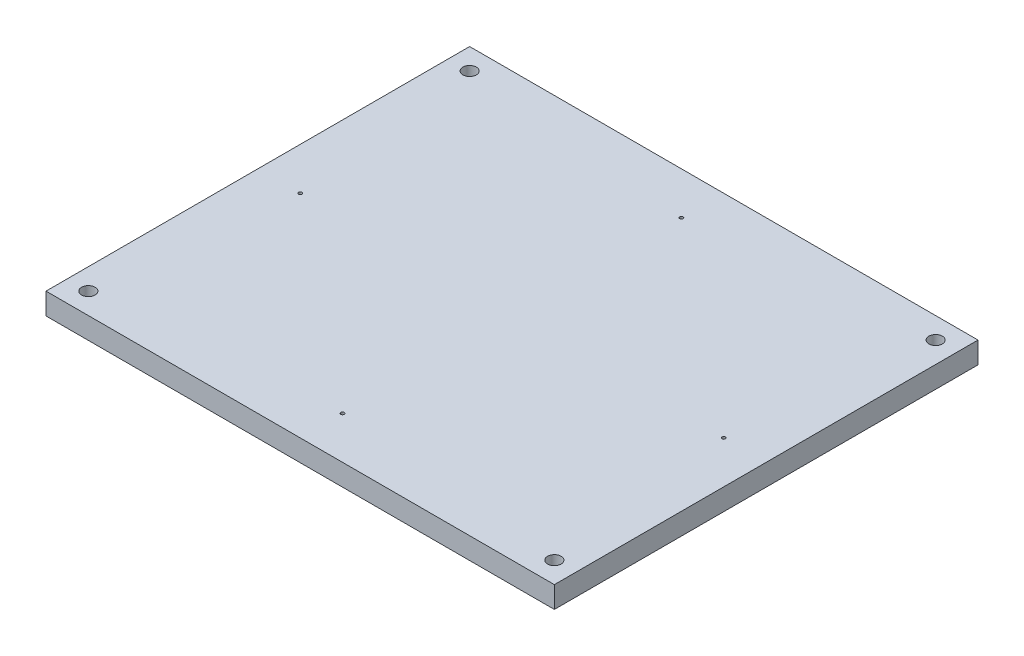
ISO-10303-21;
HEADER;
FILE_DESCRIPTION(('STEP AP214'),'2;1');
FILE_NAME('part.step','',(''),(''),'','','');
FILE_SCHEMA(('AUTOMOTIVE_DESIGN { 1 0 10303 214 1 1 1 1 }'));
ENDSEC;
DATA;
#1=APPLICATION_CONTEXT('core data for automotive mechanical design processes');
#2=APPLICATION_PROTOCOL_DEFINITION('international standard','automotive_design',2000,#1);
#3=PRODUCT_CONTEXT('',#1,'mechanical');
#4=PRODUCT('Part','Part','',(#3));
#5=PRODUCT_RELATED_PRODUCT_CATEGORY('part','',(#4));
#6=PRODUCT_DEFINITION_FORMATION('','',#4);
#7=PRODUCT_DEFINITION_CONTEXT('part definition',#1,'design');
#8=PRODUCT_DEFINITION('design','',#6,#7);
#9=PRODUCT_DEFINITION_SHAPE('','',#8);
#10=(LENGTH_UNIT() NAMED_UNIT(*) SI_UNIT(.MILLI.,.METRE.));
#11=(NAMED_UNIT(*) PLANE_ANGLE_UNIT() SI_UNIT($,.RADIAN.));
#12=(NAMED_UNIT(*) SI_UNIT($,.STERADIAN.) SOLID_ANGLE_UNIT());
#13=UNCERTAINTY_MEASURE_WITH_UNIT(LENGTH_MEASURE(1.E-05),#10,'distance_accuracy_value','');
#14=(GEOMETRIC_REPRESENTATION_CONTEXT(3) GLOBAL_UNCERTAINTY_ASSIGNED_CONTEXT((#13)) GLOBAL_UNIT_ASSIGNED_CONTEXT((#10,
#11,#12)) REPRESENTATION_CONTEXT('',''));
#15=CARTESIAN_POINT('',(0.,0.,0.));
#16=DIRECTION('',(0.,0.,1.));
#17=DIRECTION('',(1.,0.,0.));
#18=AXIS2_PLACEMENT_3D('',#15,#16,#17);
#19=CARTESIAN_POINT('',(600.,50.8,500.));
#20=DIRECTION('',(-1.,0.,0.));
#21=DIRECTION('',(0.,0.,1.));
#22=AXIS2_PLACEMENT_3D('',#19,#20,#21);
#23=PLANE('',#22);
#24=DIRECTION('',(0.,0.,-1.));
#25=VECTOR('',#24,1.);
#26=CARTESIAN_POINT('',(600.,0.,500.));
#27=LINE('',#26,#25);
#28=CARTESIAN_POINT('',(600.,0.,500.));
#29=VERTEX_POINT('',#28);
#30=CARTESIAN_POINT('',(600.,0.,-500.));
#31=VERTEX_POINT('',#30);
#32=EDGE_CURVE('E148',#29,#31,#27,.T.);
#33=ORIENTED_EDGE('',*,*,#32,.T.);
#34=DIRECTION('',(0.,-1.,0.));
#35=VECTOR('',#34,1.);
#36=CARTESIAN_POINT('',(600.,50.8,-500.));
#37=LINE('',#36,#35);
#38=CARTESIAN_POINT('',(600.,50.8,-500.));
#39=VERTEX_POINT('',#38);
#40=EDGE_CURVE('E11',#39,#31,#37,.T.);
#41=ORIENTED_EDGE('',*,*,#40,.F.);
#42=DIRECTION('',(0.,0.,-1.));
#43=VECTOR('',#42,1.);
#44=CARTESIAN_POINT('',(600.,50.8,500.));
#45=LINE('',#44,#43);
#46=CARTESIAN_POINT('',(600.,50.8,500.));
#47=VERTEX_POINT('',#46);
#48=EDGE_CURVE('E151',#47,#39,#45,.T.);
#49=ORIENTED_EDGE('',*,*,#48,.F.);
#50=DIRECTION('',(0.,-1.,0.));
#51=VECTOR('',#50,1.);
#52=CARTESIAN_POINT('',(600.,50.8,500.));
#53=LINE('',#52,#51);
#54=EDGE_CURVE('E157',#47,#29,#53,.T.);
#55=ORIENTED_EDGE('',*,*,#54,.T.);
#56=EDGE_LOOP('',(#33,#41,#49,#55));
#57=FACE_BOUND('',#56,.T.);
#58=ADVANCED_FACE('F33',(#57),#23,.F.);
#59=CARTESIAN_POINT('',(-600.,50.8,-500.));
#60=DIRECTION('',(0.,0.,1.));
#61=DIRECTION('',(1.,0.,0.));
#62=AXIS2_PLACEMENT_3D('',#59,#60,#61);
#63=PLANE('',#62);
#64=DIRECTION('',(-1.,0.,0.));
#65=VECTOR('',#64,1.);
#66=CARTESIAN_POINT('',(-600.,0.,-500.));
#67=LINE('',#66,#65);
#68=CARTESIAN_POINT('',(-600.,0.,-500.));
#69=VERTEX_POINT('',#68);
#70=EDGE_CURVE('E160',#31,#69,#67,.T.);
#71=ORIENTED_EDGE('',*,*,#70,.T.);
#72=DIRECTION('',(0.,-1.,0.));
#73=VECTOR('',#72,1.);
#74=CARTESIAN_POINT('',(-600.,50.8,-500.));
#75=LINE('',#74,#73);
#76=CARTESIAN_POINT('',(-600.,50.8,-500.));
#77=VERTEX_POINT('',#76);
#78=EDGE_CURVE('E41',#77,#69,#75,.T.);
#79=ORIENTED_EDGE('',*,*,#78,.F.);
#80=DIRECTION('',(-1.,0.,0.));
#81=VECTOR('',#80,1.);
#82=CARTESIAN_POINT('',(-600.,50.8,-500.));
#83=LINE('',#82,#81);
#84=EDGE_CURVE('E80',#39,#77,#83,.T.);
#85=ORIENTED_EDGE('',*,*,#84,.F.);
#86=ORIENTED_EDGE('',*,*,#40,.T.);
#87=EDGE_LOOP('',(#71,#79,#85,#86));
#88=FACE_BOUND('',#87,.T.);
#89=ADVANCED_FACE('F184',(#88),#63,.F.);
#90=CARTESIAN_POINT('',(-600.,50.8,500.));
#91=DIRECTION('',(1.,0.,0.));
#92=DIRECTION('',(0.,0.,-1.));
#93=AXIS2_PLACEMENT_3D('',#90,#91,#92);
#94=PLANE('',#93);
#95=DIRECTION('',(0.,0.,1.));
#96=VECTOR('',#95,1.);
#97=CARTESIAN_POINT('',(-600.,0.,500.));
#98=LINE('',#97,#96);
#99=CARTESIAN_POINT('',(-600.,0.,500.));
#100=VERTEX_POINT('',#99);
#101=EDGE_CURVE('E67',#69,#100,#98,.T.);
#102=ORIENTED_EDGE('',*,*,#101,.T.);
#103=DIRECTION('',(0.,-1.,0.));
#104=VECTOR('',#103,1.);
#105=CARTESIAN_POINT('',(-600.,50.8,500.));
#106=LINE('',#105,#104);
#107=CARTESIAN_POINT('',(-600.,50.8,500.));
#108=VERTEX_POINT('',#107);
#109=EDGE_CURVE('E165',#108,#100,#106,.T.);
#110=ORIENTED_EDGE('',*,*,#109,.F.);
#111=DIRECTION('',(0.,0.,1.));
#112=VECTOR('',#111,1.);
#113=CARTESIAN_POINT('',(-600.,50.8,500.));
#114=LINE('',#113,#112);
#115=EDGE_CURVE('E154',#77,#108,#114,.T.);
#116=ORIENTED_EDGE('',*,*,#115,.F.);
#117=ORIENTED_EDGE('',*,*,#78,.T.);
#118=EDGE_LOOP('',(#102,#110,#116,#117));
#119=FACE_BOUND('',#118,.T.);
#120=ADVANCED_FACE('F167',(#119),#94,.F.);
#121=CARTESIAN_POINT('',(-600.,50.8,500.));
#122=DIRECTION('',(0.,0.,-1.));
#123=DIRECTION('',(-1.,0.,0.));
#124=AXIS2_PLACEMENT_3D('',#121,#122,#123);
#125=PLANE('',#124);
#126=DIRECTION('',(1.,0.,0.));
#127=VECTOR('',#126,1.);
#128=CARTESIAN_POINT('',(-600.,0.,500.));
#129=LINE('',#128,#127);
#130=EDGE_CURVE('E73',#100,#29,#129,.T.);
#131=ORIENTED_EDGE('',*,*,#130,.T.);
#132=ORIENTED_EDGE('',*,*,#54,.F.);
#133=DIRECTION('',(1.,0.,0.));
#134=VECTOR('',#133,1.);
#135=CARTESIAN_POINT('',(-600.,50.8,500.));
#136=LINE('',#135,#134);
#137=EDGE_CURVE('E49',#108,#47,#136,.T.);
#138=ORIENTED_EDGE('',*,*,#137,.F.);
#139=ORIENTED_EDGE('',*,*,#109,.T.);
#140=EDGE_LOOP('',(#131,#132,#138,#139));
#141=FACE_BOUND('',#140,.T.);
#142=ADVANCED_FACE('F174',(#141),#125,.F.);
#143=CARTESIAN_POINT('',(0.,50.8,0.));
#144=DIRECTION('',(0.,-1.,0.));
#145=DIRECTION('',(0.,0.,-1.));
#146=AXIS2_PLACEMENT_3D('',#143,#144,#145);
#147=PLANE('',#146);
#148=CARTESIAN_POINT('',(-500.,50.8,0.));
#149=DIRECTION('',(0.,1.,0.));
#150=DIRECTION('',(0.,0.,1.));
#151=AXIS2_PLACEMENT_3D('',#148,#149,#150);
#152=CIRCLE('',#151,4.);
#153=CARTESIAN_POINT('',(-500.,50.8,4.));
#154=VERTEX_POINT('',#153);
#155=EDGE_CURVE('E104',#154,#154,#152,.T.);
#156=ORIENTED_EDGE('',*,*,#155,.F.);
#157=EDGE_LOOP('',(#156));
#158=FACE_BOUND('',#157,.T.);
#159=CARTESIAN_POINT('',(0.,50.8,-400.));
#160=DIRECTION('',(0.,1.,0.));
#161=DIRECTION('',(0.,0.,1.));
#162=AXIS2_PLACEMENT_3D('',#159,#160,#161);
#163=CIRCLE('',#162,4.);
#164=CARTESIAN_POINT('',(0.,50.8,-396.));
#165=VERTEX_POINT('',#164);
#166=EDGE_CURVE('E103',#165,#165,#163,.T.);
#167=ORIENTED_EDGE('',*,*,#166,.F.);
#168=EDGE_LOOP('',(#167));
#169=FACE_BOUND('',#168,.T.);
#170=CARTESIAN_POINT('',(500.,50.8,0.));
#171=DIRECTION('',(0.,1.,0.));
#172=DIRECTION('',(0.,0.,1.));
#173=AXIS2_PLACEMENT_3D('',#170,#171,#172);
#174=CIRCLE('',#173,4.);
#175=CARTESIAN_POINT('',(500.,50.8,4.));
#176=VERTEX_POINT('',#175);
#177=EDGE_CURVE('E114',#176,#176,#174,.T.);
#178=ORIENTED_EDGE('',*,*,#177,.F.);
#179=EDGE_LOOP('',(#178));
#180=FACE_BOUND('',#179,.T.);
#181=CARTESIAN_POINT('',(0.,50.8,400.));
#182=DIRECTION('',(0.,1.,0.));
#183=DIRECTION('',(0.,0.,1.));
#184=AXIS2_PLACEMENT_3D('',#181,#182,#183);
#185=CIRCLE('',#184,4.);
#186=CARTESIAN_POINT('',(0.,50.8,404.));
#187=VERTEX_POINT('',#186);
#188=EDGE_CURVE('E120',#187,#187,#185,.T.);
#189=ORIENTED_EDGE('',*,*,#188,.F.);
#190=EDGE_LOOP('',(#189));
#191=FACE_BOUND('',#190,.T.);
#192=CARTESIAN_POINT('',(-550.,50.8,450.));
#193=DIRECTION('',(0.,1.,0.));
#194=DIRECTION('',(0.,0.,1.));
#195=AXIS2_PLACEMENT_3D('',#192,#193,#194);
#196=CIRCLE('',#195,16.);
#197=CARTESIAN_POINT('',(-550.,50.8,466.));
#198=VERTEX_POINT('',#197);
#199=EDGE_CURVE('E126',#198,#198,#196,.T.);
#200=ORIENTED_EDGE('',*,*,#199,.F.);
#201=EDGE_LOOP('',(#200));
#202=FACE_BOUND('',#201,.T.);
#203=CARTESIAN_POINT('',(550.,50.8,450.));
#204=DIRECTION('',(0.,1.,0.));
#205=DIRECTION('',(0.,0.,1.));
#206=AXIS2_PLACEMENT_3D('',#203,#204,#205);
#207=CIRCLE('',#206,16.);
#208=CARTESIAN_POINT('',(550.,50.8,466.));
#209=VERTEX_POINT('',#208);
#210=EDGE_CURVE('E130',#209,#209,#207,.T.);
#211=ORIENTED_EDGE('',*,*,#210,.F.);
#212=EDGE_LOOP('',(#211));
#213=FACE_BOUND('',#212,.T.);
#214=CARTESIAN_POINT('',(550.,50.8,-450.));
#215=DIRECTION('',(0.,1.,0.));
#216=DIRECTION('',(0.,0.,1.));
#217=AXIS2_PLACEMENT_3D('',#214,#215,#216);
#218=CIRCLE('',#217,16.);
#219=CARTESIAN_POINT('',(550.,50.8,-434.));
#220=VERTEX_POINT('',#219);
#221=EDGE_CURVE('E136',#220,#220,#218,.T.);
#222=ORIENTED_EDGE('',*,*,#221,.F.);
#223=EDGE_LOOP('',(#222));
#224=FACE_BOUND('',#223,.T.);
#225=CARTESIAN_POINT('',(-550.,50.8,-450.));
#226=DIRECTION('',(0.,1.,0.));
#227=DIRECTION('',(0.,0.,1.));
#228=AXIS2_PLACEMENT_3D('',#225,#226,#227);
#229=CIRCLE('',#228,16.);
#230=CARTESIAN_POINT('',(-550.,50.8,-434.));
#231=VERTEX_POINT('',#230);
#232=EDGE_CURVE('E142',#231,#231,#229,.T.);
#233=ORIENTED_EDGE('',*,*,#232,.F.);
#234=EDGE_LOOP('',(#233));
#235=FACE_BOUND('',#234,.T.);
#236=ORIENTED_EDGE('',*,*,#48,.T.);
#237=ORIENTED_EDGE('',*,*,#84,.T.);
#238=ORIENTED_EDGE('',*,*,#115,.T.);
#239=ORIENTED_EDGE('',*,*,#137,.T.);
#240=EDGE_LOOP('',(#236,#237,#238,#239));
#241=FACE_BOUND('',#240,.T.);
#242=ADVANCED_FACE('F176',(#158,#169,#180,#191,#202,#213,#224,#235,#241),#147,.F.);
#243=CARTESIAN_POINT('',(0.,0.,0.));
#244=DIRECTION('',(0.,-1.,0.));
#245=DIRECTION('',(0.,0.,-1.));
#246=AXIS2_PLACEMENT_3D('',#243,#244,#245);
#247=PLANE('',#246);
#248=CARTESIAN_POINT('',(-550.,0.,450.));
#249=DIRECTION('',(0.,1.,0.));
#250=DIRECTION('',(0.,0.,1.));
#251=AXIS2_PLACEMENT_3D('',#248,#249,#250);
#252=CIRCLE('',#251,16.);
#253=CARTESIAN_POINT('',(-550.,0.,466.));
#254=VERTEX_POINT('',#253);
#255=EDGE_CURVE('E127',#254,#254,#252,.T.);
#256=ORIENTED_EDGE('',*,*,#255,.T.);
#257=EDGE_LOOP('',(#256));
#258=FACE_BOUND('',#257,.T.);
#259=CARTESIAN_POINT('',(550.,0.,450.));
#260=DIRECTION('',(0.,1.,0.));
#261=DIRECTION('',(0.,0.,1.));
#262=AXIS2_PLACEMENT_3D('',#259,#260,#261);
#263=CIRCLE('',#262,16.);
#264=CARTESIAN_POINT('',(550.,0.,466.));
#265=VERTEX_POINT('',#264);
#266=EDGE_CURVE('E133',#265,#265,#263,.T.);
#267=ORIENTED_EDGE('',*,*,#266,.T.);
#268=EDGE_LOOP('',(#267));
#269=FACE_BOUND('',#268,.T.);
#270=CARTESIAN_POINT('',(550.,0.,-450.));
#271=DIRECTION('',(0.,1.,0.));
#272=DIRECTION('',(0.,0.,1.));
#273=AXIS2_PLACEMENT_3D('',#270,#271,#272);
#274=CIRCLE('',#273,16.);
#275=CARTESIAN_POINT('',(550.,0.,-434.));
#276=VERTEX_POINT('',#275);
#277=EDGE_CURVE('E139',#276,#276,#274,.T.);
#278=ORIENTED_EDGE('',*,*,#277,.T.);
#279=EDGE_LOOP('',(#278));
#280=FACE_BOUND('',#279,.T.);
#281=CARTESIAN_POINT('',(-550.,0.,-450.));
#282=DIRECTION('',(0.,1.,0.));
#283=DIRECTION('',(0.,0.,1.));
#284=AXIS2_PLACEMENT_3D('',#281,#282,#283);
#285=CIRCLE('',#284,16.);
#286=CARTESIAN_POINT('',(-550.,0.,-434.));
#287=VERTEX_POINT('',#286);
#288=EDGE_CURVE('E145',#287,#287,#285,.T.);
#289=ORIENTED_EDGE('',*,*,#288,.T.);
#290=EDGE_LOOP('',(#289));
#291=FACE_BOUND('',#290,.T.);
#292=ORIENTED_EDGE('',*,*,#32,.F.);
#293=ORIENTED_EDGE('',*,*,#130,.F.);
#294=ORIENTED_EDGE('',*,*,#101,.F.);
#295=ORIENTED_EDGE('',*,*,#70,.F.);
#296=EDGE_LOOP('',(#292,#293,#294,#295));
#297=FACE_BOUND('',#296,.T.);
#298=ADVANCED_FACE('F170',(#258,#269,#280,#291,#297),#247,.T.);
#299=CARTESIAN_POINT('',(-550.,0.,-450.));
#300=DIRECTION('',(0.,1.,0.));
#301=DIRECTION('',(0.,0.,1.));
#302=AXIS2_PLACEMENT_3D('',#299,#300,#301);
#303=CYLINDRICAL_SURFACE('',#302,16.);
#304=ORIENTED_EDGE('',*,*,#288,.F.);
#305=EDGE_LOOP('',(#304));
#306=FACE_BOUND('',#305,.T.);
#307=ORIENTED_EDGE('',*,*,#232,.T.);
#308=EDGE_LOOP('',(#307));
#309=FACE_BOUND('',#308,.T.);
#310=ADVANCED_FACE('F211',(#306,#309),#303,.F.);
#311=CARTESIAN_POINT('',(550.,0.,-450.));
#312=DIRECTION('',(0.,1.,0.));
#313=DIRECTION('',(0.,0.,1.));
#314=AXIS2_PLACEMENT_3D('',#311,#312,#313);
#315=CYLINDRICAL_SURFACE('',#314,16.);
#316=ORIENTED_EDGE('',*,*,#277,.F.);
#317=EDGE_LOOP('',(#316));
#318=FACE_BOUND('',#317,.T.);
#319=ORIENTED_EDGE('',*,*,#221,.T.);
#320=EDGE_LOOP('',(#319));
#321=FACE_BOUND('',#320,.T.);
#322=ADVANCED_FACE('F220',(#318,#321),#315,.F.);
#323=CARTESIAN_POINT('',(550.,0.,450.));
#324=DIRECTION('',(0.,1.,0.));
#325=DIRECTION('',(0.,0.,1.));
#326=AXIS2_PLACEMENT_3D('',#323,#324,#325);
#327=CYLINDRICAL_SURFACE('',#326,16.);
#328=ORIENTED_EDGE('',*,*,#266,.F.);
#329=EDGE_LOOP('',(#328));
#330=FACE_BOUND('',#329,.T.);
#331=ORIENTED_EDGE('',*,*,#210,.T.);
#332=EDGE_LOOP('',(#331));
#333=FACE_BOUND('',#332,.T.);
#334=ADVANCED_FACE('F230',(#330,#333),#327,.F.);
#335=CARTESIAN_POINT('',(-550.,0.,450.));
#336=DIRECTION('',(0.,1.,0.));
#337=DIRECTION('',(0.,0.,1.));
#338=AXIS2_PLACEMENT_3D('',#335,#336,#337);
#339=CYLINDRICAL_SURFACE('',#338,16.);
#340=ORIENTED_EDGE('',*,*,#255,.F.);
#341=EDGE_LOOP('',(#340));
#342=FACE_BOUND('',#341,.T.);
#343=ORIENTED_EDGE('',*,*,#199,.T.);
#344=EDGE_LOOP('',(#343));
#345=FACE_BOUND('',#344,.T.);
#346=ADVANCED_FACE('F240',(#342,#345),#339,.F.);
#347=CARTESIAN_POINT('',(0.,35.8,400.));
#348=DIRECTION('',(0.,1.,0.));
#349=DIRECTION('',(0.,0.,1.));
#350=AXIS2_PLACEMENT_3D('',#347,#348,#349);
#351=CONICAL_SURFACE('',#350,4.,1.02974425867665);
#352=CARTESIAN_POINT('',(0.,33.3965575238898,400.));
#353=VERTEX_POINT('',#352);
#354=VERTEX_LOOP('',#353);
#355=FACE_BOUND('',#354,.T.);
#356=CARTESIAN_POINT('',(0.,35.8,400.));
#357=DIRECTION('',(0.,1.,0.));
#358=DIRECTION('',(0.,0.,1.));
#359=AXIS2_PLACEMENT_3D('',#356,#357,#358);
#360=CIRCLE('',#359,4.);
#361=CARTESIAN_POINT('',(0.,35.8,404.));
#362=VERTEX_POINT('',#361);
#363=EDGE_CURVE('E123',#362,#362,#360,.T.);
#364=ORIENTED_EDGE('',*,*,#363,.T.);
#365=EDGE_LOOP('',(#364));
#366=FACE_BOUND('',#365,.T.);
#367=ADVANCED_FACE('F250',(#355,#366),#351,.F.);
#368=CARTESIAN_POINT('',(0.,50.8,400.));
#369=DIRECTION('',(0.,1.,0.));
#370=DIRECTION('',(0.,0.,1.));
#371=AXIS2_PLACEMENT_3D('',#368,#369,#370);
#372=CYLINDRICAL_SURFACE('',#371,4.);
#373=ORIENTED_EDGE('',*,*,#363,.F.);
#374=EDGE_LOOP('',(#373));
#375=FACE_BOUND('',#374,.T.);
#376=ORIENTED_EDGE('',*,*,#188,.T.);
#377=EDGE_LOOP('',(#376));
#378=FACE_BOUND('',#377,.T.);
#379=ADVANCED_FACE('F265',(#375,#378),#372,.F.);
#380=CARTESIAN_POINT('',(500.,35.8,0.));
#381=DIRECTION('',(0.,1.,0.));
#382=DIRECTION('',(0.,0.,1.));
#383=AXIS2_PLACEMENT_3D('',#380,#381,#382);
#384=CONICAL_SURFACE('',#383,4.,1.02974425867666);
#385=CARTESIAN_POINT('',(500.,33.3965575238898,0.));
#386=VERTEX_POINT('',#385);
#387=VERTEX_LOOP('',#386);
#388=FACE_BOUND('',#387,.T.);
#389=CARTESIAN_POINT('',(500.,35.8,0.));
#390=DIRECTION('',(0.,1.,0.));
#391=DIRECTION('',(0.,0.,1.));
#392=AXIS2_PLACEMENT_3D('',#389,#390,#391);
#393=CIRCLE('',#392,4.);
#394=CARTESIAN_POINT('',(500.,35.8,4.));
#395=VERTEX_POINT('',#394);
#396=EDGE_CURVE('E117',#395,#395,#393,.T.);
#397=ORIENTED_EDGE('',*,*,#396,.T.);
#398=EDGE_LOOP('',(#397));
#399=FACE_BOUND('',#398,.T.);
#400=ADVANCED_FACE('F275',(#388,#399),#384,.F.);
#401=CARTESIAN_POINT('',(500.,50.8,0.));
#402=DIRECTION('',(0.,1.,0.));
#403=DIRECTION('',(0.,0.,1.));
#404=AXIS2_PLACEMENT_3D('',#401,#402,#403);
#405=CYLINDRICAL_SURFACE('',#404,4.);
#406=ORIENTED_EDGE('',*,*,#396,.F.);
#407=EDGE_LOOP('',(#406));
#408=FACE_BOUND('',#407,.T.);
#409=ORIENTED_EDGE('',*,*,#177,.T.);
#410=EDGE_LOOP('',(#409));
#411=FACE_BOUND('',#410,.T.);
#412=ADVANCED_FACE('F285',(#408,#411),#405,.F.);
#413=CARTESIAN_POINT('',(0.,35.8,-400.));
#414=DIRECTION('',(0.,1.,0.));
#415=DIRECTION('',(0.,0.,1.));
#416=AXIS2_PLACEMENT_3D('',#413,#414,#415);
#417=CONICAL_SURFACE('',#416,4.,1.02974425867665);
#418=CARTESIAN_POINT('',(0.,33.3965575238898,-400.));
#419=VERTEX_POINT('',#418);
#420=VERTEX_LOOP('',#419);
#421=FACE_BOUND('',#420,.T.);
#422=CARTESIAN_POINT('',(0.,35.8,-400.));
#423=DIRECTION('',(0.,1.,0.));
#424=DIRECTION('',(0.,0.,1.));
#425=AXIS2_PLACEMENT_3D('',#422,#423,#424);
#426=CIRCLE('',#425,4.);
#427=CARTESIAN_POINT('',(0.,35.8,-396.));
#428=VERTEX_POINT('',#427);
#429=EDGE_CURVE('E107',#428,#428,#426,.T.);
#430=ORIENTED_EDGE('',*,*,#429,.T.);
#431=EDGE_LOOP('',(#430));
#432=FACE_BOUND('',#431,.T.);
#433=ADVANCED_FACE('F295',(#421,#432),#417,.F.);
#434=CARTESIAN_POINT('',(0.,50.8,-400.));
#435=DIRECTION('',(0.,1.,0.));
#436=DIRECTION('',(0.,0.,1.));
#437=AXIS2_PLACEMENT_3D('',#434,#435,#436);
#438=CYLINDRICAL_SURFACE('',#437,4.);
#439=ORIENTED_EDGE('',*,*,#429,.F.);
#440=EDGE_LOOP('',(#439));
#441=FACE_BOUND('',#440,.T.);
#442=ORIENTED_EDGE('',*,*,#166,.T.);
#443=EDGE_LOOP('',(#442));
#444=FACE_BOUND('',#443,.T.);
#445=ADVANCED_FACE('F97',(#441,#444),#438,.F.);
#446=CARTESIAN_POINT('',(-500.,35.8,0.));
#447=DIRECTION('',(0.,1.,0.));
#448=DIRECTION('',(0.,0.,1.));
#449=AXIS2_PLACEMENT_3D('',#446,#447,#448);
#450=CONICAL_SURFACE('',#449,4.,1.02974425867666);
#451=CARTESIAN_POINT('',(-500.,33.3965575238898,0.));
#452=VERTEX_POINT('',#451);
#453=VERTEX_LOOP('',#452);
#454=FACE_BOUND('',#453,.T.);
#455=CARTESIAN_POINT('',(-500.,35.8,0.));
#456=DIRECTION('',(0.,1.,0.));
#457=DIRECTION('',(0.,0.,1.));
#458=AXIS2_PLACEMENT_3D('',#455,#456,#457);
#459=CIRCLE('',#458,4.);
#460=CARTESIAN_POINT('',(-500.,35.8,4.));
#461=VERTEX_POINT('',#460);
#462=EDGE_CURVE('E101',#461,#461,#459,.T.);
#463=ORIENTED_EDGE('',*,*,#462,.T.);
#464=EDGE_LOOP('',(#463));
#465=FACE_BOUND('',#464,.T.);
#466=ADVANCED_FACE('F93',(#454,#465),#450,.F.);
#467=CARTESIAN_POINT('',(-500.,50.8,0.));
#468=DIRECTION('',(0.,1.,0.));
#469=DIRECTION('',(0.,0.,1.));
#470=AXIS2_PLACEMENT_3D('',#467,#468,#469);
#471=CYLINDRICAL_SURFACE('',#470,4.);
#472=ORIENTED_EDGE('',*,*,#462,.F.);
#473=EDGE_LOOP('',(#472));
#474=FACE_BOUND('',#473,.T.);
#475=ORIENTED_EDGE('',*,*,#155,.T.);
#476=EDGE_LOOP('',(#475));
#477=FACE_BOUND('',#476,.T.);
#478=ADVANCED_FACE('F96',(#474,#477),#471,.F.);
#479=CLOSED_SHELL('',(#58,#89,#120,#142,#242,#298,#310,#322,#334,#346,#367,#379,#400,#412,#433,
#445,#466,#478));
#480=MANIFOLD_SOLID_BREP('B2',#479);
#481=ADVANCED_BREP_SHAPE_REPRESENTATION('',(#18,#480),#14);
#482=SHAPE_DEFINITION_REPRESENTATION(#9,#481);
ENDSEC;
END-ISO-10303-21;
